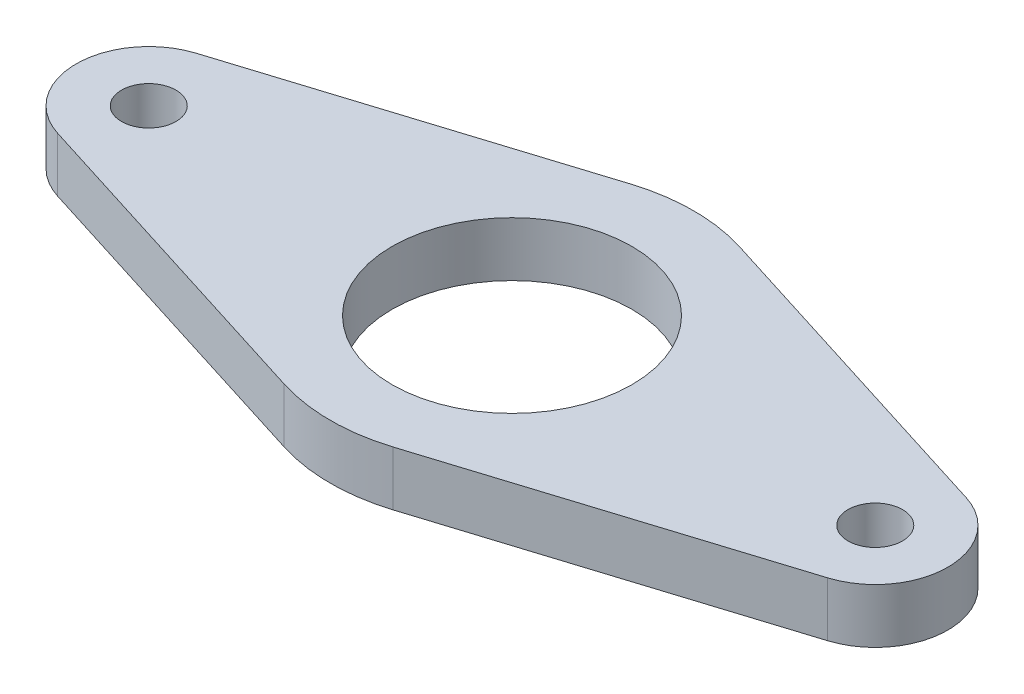
ISO-10303-21;
HEADER;
FILE_DESCRIPTION(('STEP AP214'),'2;1');
FILE_NAME('part.step','',(''),(''),'','','');
FILE_SCHEMA(('AUTOMOTIVE_DESIGN { 1 0 10303 214 1 1 1 1 }'));
ENDSEC;
DATA;
#1=APPLICATION_CONTEXT('core data for automotive mechanical design processes');
#2=APPLICATION_PROTOCOL_DEFINITION('international standard','automotive_design',2000,#1);
#3=PRODUCT_CONTEXT('',#1,'mechanical');
#4=PRODUCT('Part','Part','',(#3));
#5=PRODUCT_RELATED_PRODUCT_CATEGORY('part','',(#4));
#6=PRODUCT_DEFINITION_FORMATION('','',#4);
#7=PRODUCT_DEFINITION_CONTEXT('part definition',#1,'design');
#8=PRODUCT_DEFINITION('design','',#6,#7);
#9=PRODUCT_DEFINITION_SHAPE('','',#8);
#10=(LENGTH_UNIT() NAMED_UNIT(*) SI_UNIT(.MILLI.,.METRE.));
#11=(NAMED_UNIT(*) PLANE_ANGLE_UNIT() SI_UNIT($,.RADIAN.));
#12=(NAMED_UNIT(*) SI_UNIT($,.STERADIAN.) SOLID_ANGLE_UNIT());
#13=UNCERTAINTY_MEASURE_WITH_UNIT(LENGTH_MEASURE(1.E-05),#10,'distance_accuracy_value','');
#14=(GEOMETRIC_REPRESENTATION_CONTEXT(3) GLOBAL_UNCERTAINTY_ASSIGNED_CONTEXT((#13)) GLOBAL_UNIT_ASSIGNED_CONTEXT((#10,
#11,#12)) REPRESENTATION_CONTEXT('',''));
#15=CARTESIAN_POINT('',(0.,0.,0.));
#16=DIRECTION('',(0.,0.,1.));
#17=DIRECTION('',(1.,0.,0.));
#18=AXIS2_PLACEMENT_3D('',#15,#16,#17);
#19=CARTESIAN_POINT('',(-3.,3.,9.53939201416945));
#20=DIRECTION('',(0.3,0.,-0.953939201416946));
#21=DIRECTION('',(-0.953939201416946,0.,-0.3));
#22=AXIS2_PLACEMENT_3D('',#19,#20,#21);
#23=PLANE('',#22);
#24=DIRECTION('',(0.953939201416946,0.,0.3));
#25=VECTOR('',#24,1.);
#26=CARTESIAN_POINT('',(-3.,0.,9.53939201416945));
#27=LINE('',#26,#25);
#28=CARTESIAN_POINT('',(-21.2,0.,3.81575680566778));
#29=VERTEX_POINT('',#28);
#30=CARTESIAN_POINT('',(-3.,0.,9.53939201416945));
#31=VERTEX_POINT('',#30);
#32=EDGE_CURVE('E151',#29,#31,#27,.T.);
#33=ORIENTED_EDGE('',*,*,#32,.T.);
#34=DIRECTION('',(0.,-1.,0.));
#35=VECTOR('',#34,1.);
#36=CARTESIAN_POINT('',(-3.,3.,9.53939201416945));
#37=LINE('',#36,#35);
#38=CARTESIAN_POINT('',(-3.,3.,9.53939201416945));
#39=VERTEX_POINT('',#38);
#40=EDGE_CURVE('E12',#39,#31,#37,.T.);
#41=ORIENTED_EDGE('',*,*,#40,.F.);
#42=DIRECTION('',(0.953939201416946,0.,0.3));
#43=VECTOR('',#42,1.);
#44=CARTESIAN_POINT('',(-3.,3.,9.53939201416945));
#45=LINE('',#44,#43);
#46=CARTESIAN_POINT('',(-21.2,3.,3.81575680566778));
#47=VERTEX_POINT('',#46);
#48=EDGE_CURVE('E213',#47,#39,#45,.T.);
#49=ORIENTED_EDGE('',*,*,#48,.F.);
#50=DIRECTION('',(0.,-1.,0.));
#51=VECTOR('',#50,1.);
#52=CARTESIAN_POINT('',(-21.2,3.,3.81575680566778));
#53=LINE('',#52,#51);
#54=EDGE_CURVE('E57',#47,#29,#53,.T.);
#55=ORIENTED_EDGE('',*,*,#54,.T.);
#56=EDGE_LOOP('',(#33,#41,#49,#55));
#57=FACE_BOUND('',#56,.T.);
#58=ADVANCED_FACE('F40',(#57),#23,.F.);
#59=CARTESIAN_POINT('',(0.,3.,0.));
#60=DIRECTION('',(0.,-1.,0.));
#61=DIRECTION('',(0.,0.,-1.));
#62=AXIS2_PLACEMENT_3D('',#59,#60,#61);
#63=CYLINDRICAL_SURFACE('',#62,9.99999999999999);
#64=CARTESIAN_POINT('',(0.,0.,0.));
#65=DIRECTION('',(0.,1.,0.));
#66=DIRECTION('',(0.,0.,1.));
#67=AXIS2_PLACEMENT_3D('',#64,#65,#66);
#68=CIRCLE('',#67,9.99999999999999);
#69=CARTESIAN_POINT('',(3.,0.,9.53939201416945));
#70=VERTEX_POINT('',#69);
#71=EDGE_CURVE('E153',#31,#70,#68,.T.);
#72=ORIENTED_EDGE('',*,*,#71,.T.);
#73=DIRECTION('',(0.,-1.,0.));
#74=VECTOR('',#73,1.);
#75=CARTESIAN_POINT('',(3.,3.,9.53939201416945));
#76=LINE('',#75,#74);
#77=CARTESIAN_POINT('',(3.,3.,9.53939201416945));
#78=VERTEX_POINT('',#77);
#79=EDGE_CURVE('E49',#78,#70,#76,.T.);
#80=ORIENTED_EDGE('',*,*,#79,.F.);
#81=CARTESIAN_POINT('',(0.,3.,0.));
#82=DIRECTION('',(0.,1.,0.));
#83=DIRECTION('',(0.,0.,1.));
#84=AXIS2_PLACEMENT_3D('',#81,#82,#83);
#85=CIRCLE('',#84,9.99999999999999);
#86=EDGE_CURVE('E95',#39,#78,#85,.T.);
#87=ORIENTED_EDGE('',*,*,#86,.F.);
#88=ORIENTED_EDGE('',*,*,#40,.T.);
#89=EDGE_LOOP('',(#72,#80,#87,#88));
#90=FACE_BOUND('',#89,.T.);
#91=ADVANCED_FACE('F183',(#90),#63,.T.);
#92=CARTESIAN_POINT('',(3.,3.,9.53939201416945));
#93=DIRECTION('',(0.3,0.,0.953939201416945));
#94=DIRECTION('',(0.953939201416946,0.,-0.3));
#95=AXIS2_PLACEMENT_3D('',#92,#93,#94);
#96=PLANE('',#95);
#97=DIRECTION('',(-0.953939201416946,0.,0.3));
#98=VECTOR('',#97,1.);
#99=CARTESIAN_POINT('',(3.,0.,9.53939201416945));
#100=LINE('',#99,#98);
#101=CARTESIAN_POINT('',(21.2,0.,3.81575680566777));
#102=VERTEX_POINT('',#101);
#103=EDGE_CURVE('E156',#102,#70,#100,.T.);
#104=ORIENTED_EDGE('',*,*,#103,.F.);
#105=DIRECTION('',(0.,-1.,0.));
#106=VECTOR('',#105,1.);
#107=CARTESIAN_POINT('',(21.2,3.,3.81575680566777));
#108=LINE('',#107,#106);
#109=CARTESIAN_POINT('',(21.2,3.,3.81575680566777));
#110=VERTEX_POINT('',#109);
#111=EDGE_CURVE('E176',#110,#102,#108,.T.);
#112=ORIENTED_EDGE('',*,*,#111,.F.);
#113=DIRECTION('',(-0.953939201416946,0.,0.3));
#114=VECTOR('',#113,1.);
#115=CARTESIAN_POINT('',(3.,3.,9.53939201416945));
#116=LINE('',#115,#114);
#117=EDGE_CURVE('E182',#110,#78,#116,.T.);
#118=ORIENTED_EDGE('',*,*,#117,.T.);
#119=ORIENTED_EDGE('',*,*,#79,.T.);
#120=EDGE_LOOP('',(#104,#112,#118,#119));
#121=FACE_BOUND('',#120,.T.);
#122=ADVANCED_FACE('F180',(#121),#96,.T.);
#123=CARTESIAN_POINT('',(20.,3.,0.));
#124=DIRECTION('',(0.,-1.,0.));
#125=DIRECTION('',(0.,0.,-1.));
#126=AXIS2_PLACEMENT_3D('',#123,#124,#125);
#127=CYLINDRICAL_SURFACE('',#126,3.99999999999999);
#128=CARTESIAN_POINT('',(20.,0.,0.));
#129=DIRECTION('',(0.,1.,0.));
#130=DIRECTION('',(0.,0.,1.));
#131=AXIS2_PLACEMENT_3D('',#128,#129,#130);
#132=CIRCLE('',#131,3.99999999999999);
#133=CARTESIAN_POINT('',(21.2,0.,-3.81575680566777));
#134=VERTEX_POINT('',#133);
#135=EDGE_CURVE('E159',#102,#134,#132,.T.);
#136=ORIENTED_EDGE('',*,*,#135,.T.);
#137=DIRECTION('',(0.,-1.,0.));
#138=VECTOR('',#137,1.);
#139=CARTESIAN_POINT('',(21.2,3.,-3.81575680566777));
#140=LINE('',#139,#138);
#141=CARTESIAN_POINT('',(21.2,3.,-3.81575680566777));
#142=VERTEX_POINT('',#141);
#143=EDGE_CURVE('E173',#142,#134,#140,.T.);
#144=ORIENTED_EDGE('',*,*,#143,.F.);
#145=CARTESIAN_POINT('',(20.,3.,0.));
#146=DIRECTION('',(0.,1.,0.));
#147=DIRECTION('',(0.,0.,1.));
#148=AXIS2_PLACEMENT_3D('',#145,#146,#147);
#149=CIRCLE('',#148,3.99999999999999);
#150=EDGE_CURVE('E196',#110,#142,#149,.T.);
#151=ORIENTED_EDGE('',*,*,#150,.F.);
#152=ORIENTED_EDGE('',*,*,#111,.T.);
#153=EDGE_LOOP('',(#136,#144,#151,#152));
#154=FACE_BOUND('',#153,.T.);
#155=ADVANCED_FACE('F191',(#154),#127,.T.);
#156=CARTESIAN_POINT('',(3.,3.,-9.53939201416945));
#157=DIRECTION('',(-0.3,0.,0.953939201416946));
#158=DIRECTION('',(0.953939201416946,0.,0.3));
#159=AXIS2_PLACEMENT_3D('',#156,#157,#158);
#160=PLANE('',#159);
#161=DIRECTION('',(-0.953939201416946,0.,-0.3));
#162=VECTOR('',#161,1.);
#163=CARTESIAN_POINT('',(3.,0.,-9.53939201416945));
#164=LINE('',#163,#162);
#165=CARTESIAN_POINT('',(3.,0.,-9.53939201416945));
#166=VERTEX_POINT('',#165);
#167=EDGE_CURVE('E161',#134,#166,#164,.T.);
#168=ORIENTED_EDGE('',*,*,#167,.T.);
#169=DIRECTION('',(0.,-1.,0.));
#170=VECTOR('',#169,1.);
#171=CARTESIAN_POINT('',(3.,3.,-9.53939201416945));
#172=LINE('',#171,#170);
#173=CARTESIAN_POINT('',(3.,3.,-9.53939201416945));
#174=VERTEX_POINT('',#173);
#175=EDGE_CURVE('E131',#174,#166,#172,.T.);
#176=ORIENTED_EDGE('',*,*,#175,.F.);
#177=DIRECTION('',(-0.953939201416946,0.,-0.3));
#178=VECTOR('',#177,1.);
#179=CARTESIAN_POINT('',(3.,3.,-9.53939201416945));
#180=LINE('',#179,#178);
#181=EDGE_CURVE('E118',#142,#174,#180,.T.);
#182=ORIENTED_EDGE('',*,*,#181,.F.);
#183=ORIENTED_EDGE('',*,*,#143,.T.);
#184=EDGE_LOOP('',(#168,#176,#182,#183));
#185=FACE_BOUND('',#184,.T.);
#186=ADVANCED_FACE('F194',(#185),#160,.F.);
#187=CARTESIAN_POINT('',(0.,3.,0.));
#188=DIRECTION('',(0.,-1.,0.));
#189=DIRECTION('',(0.,0.,-1.));
#190=AXIS2_PLACEMENT_3D('',#187,#188,#189);
#191=CYLINDRICAL_SURFACE('',#190,9.99999999999999);
#192=CARTESIAN_POINT('',(0.,0.,0.));
#193=DIRECTION('',(0.,1.,0.));
#194=DIRECTION('',(0.,0.,1.));
#195=AXIS2_PLACEMENT_3D('',#192,#193,#194);
#196=CIRCLE('',#195,9.99999999999999);
#197=CARTESIAN_POINT('',(-3.,0.,-9.53939201416945));
#198=VERTEX_POINT('',#197);
#199=EDGE_CURVE('E128',#166,#198,#196,.T.);
#200=ORIENTED_EDGE('',*,*,#199,.T.);
#201=DIRECTION('',(0.,-1.,0.));
#202=VECTOR('',#201,1.);
#203=CARTESIAN_POINT('',(-3.,3.,-9.53939201416945));
#204=LINE('',#203,#202);
#205=CARTESIAN_POINT('',(-3.,3.,-9.53939201416945));
#206=VERTEX_POINT('',#205);
#207=EDGE_CURVE('E125',#206,#198,#204,.T.);
#208=ORIENTED_EDGE('',*,*,#207,.F.);
#209=CARTESIAN_POINT('',(0.,3.,0.));
#210=DIRECTION('',(0.,1.,0.));
#211=DIRECTION('',(0.,0.,1.));
#212=AXIS2_PLACEMENT_3D('',#209,#210,#211);
#213=CIRCLE('',#212,9.99999999999999);
#214=EDGE_CURVE('E111',#174,#206,#213,.T.);
#215=ORIENTED_EDGE('',*,*,#214,.F.);
#216=ORIENTED_EDGE('',*,*,#175,.T.);
#217=EDGE_LOOP('',(#200,#208,#215,#216));
#218=FACE_BOUND('',#217,.T.);
#219=ADVANCED_FACE('F126',(#218),#191,.T.);
#220=CARTESIAN_POINT('',(-3.,3.,-9.53939201416945));
#221=DIRECTION('',(-0.3,0.,-0.953939201416946));
#222=DIRECTION('',(-0.953939201416946,0.,0.3));
#223=AXIS2_PLACEMENT_3D('',#220,#221,#222);
#224=PLANE('',#223);
#225=DIRECTION('',(0.953939201416946,0.,-0.3));
#226=VECTOR('',#225,1.);
#227=CARTESIAN_POINT('',(-3.,0.,-9.53939201416945));
#228=LINE('',#227,#226);
#229=CARTESIAN_POINT('',(-21.2,0.,-3.81575680566777));
#230=VERTEX_POINT('',#229);
#231=EDGE_CURVE('E164',#230,#198,#228,.T.);
#232=ORIENTED_EDGE('',*,*,#231,.F.);
#233=DIRECTION('',(0.,-1.,0.));
#234=VECTOR('',#233,1.);
#235=CARTESIAN_POINT('',(-21.2,3.,-3.81575680566777));
#236=LINE('',#235,#234);
#237=CARTESIAN_POINT('',(-21.2,3.,-3.81575680566777));
#238=VERTEX_POINT('',#237);
#239=EDGE_CURVE('E83',#238,#230,#236,.T.);
#240=ORIENTED_EDGE('',*,*,#239,.F.);
#241=DIRECTION('',(0.953939201416946,0.,-0.3));
#242=VECTOR('',#241,1.);
#243=CARTESIAN_POINT('',(-3.,3.,-9.53939201416945));
#244=LINE('',#243,#242);
#245=EDGE_CURVE('E116',#238,#206,#244,.T.);
#246=ORIENTED_EDGE('',*,*,#245,.T.);
#247=ORIENTED_EDGE('',*,*,#207,.T.);
#248=EDGE_LOOP('',(#232,#240,#246,#247));
#249=FACE_BOUND('',#248,.T.);
#250=ADVANCED_FACE('F133',(#249),#224,.T.);
#251=CARTESIAN_POINT('',(0.,3.,0.));
#252=DIRECTION('',(0.,-1.,0.));
#253=DIRECTION('',(0.,0.,-1.));
#254=AXIS2_PLACEMENT_3D('',#251,#252,#253);
#255=CYLINDRICAL_SURFACE('',#254,6.6);
#256=CARTESIAN_POINT('',(0.,3.,0.));
#257=DIRECTION('',(0.,1.,0.));
#258=DIRECTION('',(0.,0.,1.));
#259=AXIS2_PLACEMENT_3D('',#256,#257,#258);
#260=CIRCLE('',#259,6.6);
#261=CARTESIAN_POINT('',(0.,3.,6.6));
#262=VERTEX_POINT('',#261);
#263=EDGE_CURVE('E217',#262,#262,#260,.T.);
#264=ORIENTED_EDGE('',*,*,#263,.T.);
#265=EDGE_LOOP('',(#264));
#266=FACE_BOUND('',#265,.T.);
#267=CARTESIAN_POINT('',(0.,0.,0.));
#268=DIRECTION('',(0.,1.,0.));
#269=DIRECTION('',(0.,0.,1.));
#270=AXIS2_PLACEMENT_3D('',#267,#268,#269);
#271=CIRCLE('',#270,6.6);
#272=CARTESIAN_POINT('',(0.,0.,6.6));
#273=VERTEX_POINT('',#272);
#274=EDGE_CURVE('E148',#273,#273,#271,.T.);
#275=ORIENTED_EDGE('',*,*,#274,.F.);
#276=EDGE_LOOP('',(#275));
#277=FACE_BOUND('',#276,.T.);
#278=ADVANCED_FACE('F245',(#266,#277),#255,.F.);
#279=CARTESIAN_POINT('',(20.,3.,0.));
#280=DIRECTION('',(0.,-1.,0.));
#281=DIRECTION('',(0.,0.,-1.));
#282=AXIS2_PLACEMENT_3D('',#279,#280,#281);
#283=CYLINDRICAL_SURFACE('',#282,1.5);
#284=CARTESIAN_POINT('',(20.,3.,0.));
#285=DIRECTION('',(0.,1.,0.));
#286=DIRECTION('',(0.,0.,1.));
#287=AXIS2_PLACEMENT_3D('',#284,#285,#286);
#288=CIRCLE('',#287,1.5);
#289=CARTESIAN_POINT('',(20.,3.,1.5));
#290=VERTEX_POINT('',#289);
#291=EDGE_CURVE('E224',#290,#290,#288,.T.);
#292=ORIENTED_EDGE('',*,*,#291,.T.);
#293=EDGE_LOOP('',(#292));
#294=FACE_BOUND('',#293,.T.);
#295=CARTESIAN_POINT('',(20.,0.,0.));
#296=DIRECTION('',(0.,1.,0.));
#297=DIRECTION('',(0.,0.,1.));
#298=AXIS2_PLACEMENT_3D('',#295,#296,#297);
#299=CIRCLE('',#298,1.5);
#300=CARTESIAN_POINT('',(20.,0.,1.5));
#301=VERTEX_POINT('',#300);
#302=EDGE_CURVE('E145',#301,#301,#299,.T.);
#303=ORIENTED_EDGE('',*,*,#302,.F.);
#304=EDGE_LOOP('',(#303));
#305=FACE_BOUND('',#304,.T.);
#306=ADVANCED_FACE('F248',(#294,#305),#283,.F.);
#307=CARTESIAN_POINT('',(-20.,3.,0.));
#308=DIRECTION('',(0.,-1.,0.));
#309=DIRECTION('',(0.,0.,-1.));
#310=AXIS2_PLACEMENT_3D('',#307,#308,#309);
#311=CYLINDRICAL_SURFACE('',#310,1.5);
#312=CARTESIAN_POINT('',(-20.,3.,0.));
#313=DIRECTION('',(0.,1.,0.));
#314=DIRECTION('',(0.,0.,1.));
#315=AXIS2_PLACEMENT_3D('',#312,#313,#314);
#316=CIRCLE('',#315,1.5);
#317=CARTESIAN_POINT('',(-20.,3.,1.5));
#318=VERTEX_POINT('',#317);
#319=EDGE_CURVE('E169',#318,#318,#316,.T.);
#320=ORIENTED_EDGE('',*,*,#319,.T.);
#321=EDGE_LOOP('',(#320));
#322=FACE_BOUND('',#321,.T.);
#323=CARTESIAN_POINT('',(-20.,0.,0.));
#324=DIRECTION('',(0.,1.,0.));
#325=DIRECTION('',(0.,0.,1.));
#326=AXIS2_PLACEMENT_3D('',#323,#324,#325);
#327=CIRCLE('',#326,1.5);
#328=CARTESIAN_POINT('',(-20.,0.,1.5));
#329=VERTEX_POINT('',#328);
#330=EDGE_CURVE('E142',#329,#329,#327,.T.);
#331=ORIENTED_EDGE('',*,*,#330,.F.);
#332=EDGE_LOOP('',(#331));
#333=FACE_BOUND('',#332,.T.);
#334=ADVANCED_FACE('F42',(#322,#333),#311,.F.);
#335=CARTESIAN_POINT('',(-20.,3.,0.));
#336=DIRECTION('',(0.,-1.,0.));
#337=DIRECTION('',(0.,0.,-1.));
#338=AXIS2_PLACEMENT_3D('',#335,#336,#337);
#339=CYLINDRICAL_SURFACE('',#338,3.99999999999999);
#340=CARTESIAN_POINT('',(-20.,0.,0.));
#341=DIRECTION('',(0.,1.,0.));
#342=DIRECTION('',(0.,0.,1.));
#343=AXIS2_PLACEMENT_3D('',#340,#341,#342);
#344=CIRCLE('',#343,3.99999999999999);
#345=EDGE_CURVE('E166',#29,#230,#344,.F.);
#346=ORIENTED_EDGE('',*,*,#345,.F.);
#347=ORIENTED_EDGE('',*,*,#54,.F.);
#348=CARTESIAN_POINT('',(-20.,3.,0.));
#349=DIRECTION('',(0.,1.,0.));
#350=DIRECTION('',(0.,0.,1.));
#351=AXIS2_PLACEMENT_3D('',#348,#349,#350);
#352=CIRCLE('',#351,3.99999999999999);
#353=EDGE_CURVE('E135',#47,#238,#352,.F.);
#354=ORIENTED_EDGE('',*,*,#353,.T.);
#355=ORIENTED_EDGE('',*,*,#239,.T.);
#356=EDGE_LOOP('',(#346,#347,#354,#355));
#357=FACE_BOUND('',#356,.T.);
#358=ADVANCED_FACE('F237',(#357),#339,.T.);
#359=CARTESIAN_POINT('',(0.,3.,0.));
#360=DIRECTION('',(0.,1.,0.));
#361=DIRECTION('',(0.,0.,1.));
#362=AXIS2_PLACEMENT_3D('',#359,#360,#361);
#363=PLANE('',#362);
#364=ORIENTED_EDGE('',*,*,#319,.F.);
#365=EDGE_LOOP('',(#364));
#366=FACE_BOUND('',#365,.T.);
#367=ORIENTED_EDGE('',*,*,#291,.F.);
#368=EDGE_LOOP('',(#367));
#369=FACE_BOUND('',#368,.T.);
#370=ORIENTED_EDGE('',*,*,#263,.F.);
#371=EDGE_LOOP('',(#370));
#372=FACE_BOUND('',#371,.T.);
#373=ORIENTED_EDGE('',*,*,#48,.T.);
#374=ORIENTED_EDGE('',*,*,#86,.T.);
#375=ORIENTED_EDGE('',*,*,#117,.F.);
#376=ORIENTED_EDGE('',*,*,#150,.T.);
#377=ORIENTED_EDGE('',*,*,#181,.T.);
#378=ORIENTED_EDGE('',*,*,#214,.T.);
#379=ORIENTED_EDGE('',*,*,#245,.F.);
#380=ORIENTED_EDGE('',*,*,#353,.F.);
#381=EDGE_LOOP('',(#373,#374,#375,#376,#377,#378,#379,#380));
#382=FACE_BOUND('',#381,.T.);
#383=ADVANCED_FACE('F113',(#366,#369,#372,#382),#363,.T.);
#384=CARTESIAN_POINT('',(0.,0.,0.));
#385=DIRECTION('',(0.,1.,0.));
#386=DIRECTION('',(0.,0.,1.));
#387=AXIS2_PLACEMENT_3D('',#384,#385,#386);
#388=PLANE('',#387);
#389=ORIENTED_EDGE('',*,*,#330,.T.);
#390=EDGE_LOOP('',(#389));
#391=FACE_BOUND('',#390,.T.);
#392=ORIENTED_EDGE('',*,*,#302,.T.);
#393=EDGE_LOOP('',(#392));
#394=FACE_BOUND('',#393,.T.);
#395=ORIENTED_EDGE('',*,*,#274,.T.);
#396=EDGE_LOOP('',(#395));
#397=FACE_BOUND('',#396,.T.);
#398=ORIENTED_EDGE('',*,*,#32,.F.);
#399=ORIENTED_EDGE('',*,*,#345,.T.);
#400=ORIENTED_EDGE('',*,*,#231,.T.);
#401=ORIENTED_EDGE('',*,*,#199,.F.);
#402=ORIENTED_EDGE('',*,*,#167,.F.);
#403=ORIENTED_EDGE('',*,*,#135,.F.);
#404=ORIENTED_EDGE('',*,*,#103,.T.);
#405=ORIENTED_EDGE('',*,*,#71,.F.);
#406=EDGE_LOOP('',(#398,#399,#400,#401,#402,#403,#404,#405));
#407=FACE_BOUND('',#406,.T.);
#408=ADVANCED_FACE('F187',(#391,#394,#397,#407),#388,.F.);
#409=CLOSED_SHELL('',(#58,#91,#122,#155,#186,#219,#250,#278,#306,#334,#358,#383,#408));
#410=MANIFOLD_SOLID_BREP('B2',#409);
#411=ADVANCED_BREP_SHAPE_REPRESENTATION('',(#18,#410),#14);
#412=SHAPE_DEFINITION_REPRESENTATION(#9,#411);
ENDSEC;
END-ISO-10303-21;
